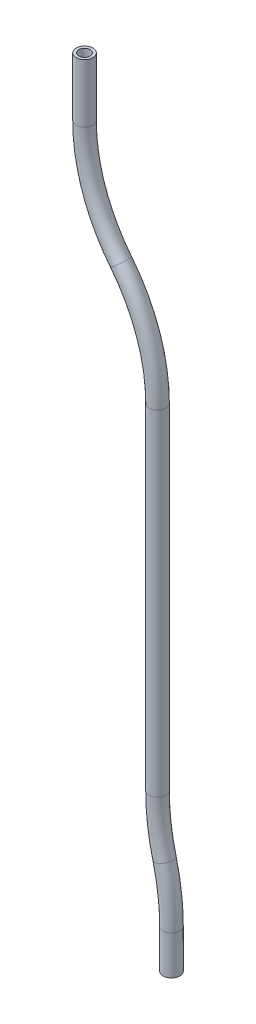
ISO-10303-21;
HEADER;
FILE_DESCRIPTION(('STEP AP214'),'2;1');
FILE_NAME('part.step','',(''),(''),'','','');
FILE_SCHEMA(('AUTOMOTIVE_DESIGN { 1 0 10303 214 1 1 1 1 }'));
ENDSEC;
DATA;
#1=APPLICATION_CONTEXT('core data for automotive mechanical design processes');
#2=APPLICATION_PROTOCOL_DEFINITION('international standard','automotive_design',2000,#1);
#3=PRODUCT_CONTEXT('',#1,'mechanical');
#4=PRODUCT('Part','Part','',(#3));
#5=PRODUCT_RELATED_PRODUCT_CATEGORY('part','',(#4));
#6=PRODUCT_DEFINITION_FORMATION('','',#4);
#7=PRODUCT_DEFINITION_CONTEXT('part definition',#1,'design');
#8=PRODUCT_DEFINITION('design','',#6,#7);
#9=PRODUCT_DEFINITION_SHAPE('','',#8);
#10=(LENGTH_UNIT() NAMED_UNIT(*) SI_UNIT(.MILLI.,.METRE.));
#11=(NAMED_UNIT(*) PLANE_ANGLE_UNIT() SI_UNIT($,.RADIAN.));
#12=(NAMED_UNIT(*) SI_UNIT($,.STERADIAN.) SOLID_ANGLE_UNIT());
#13=UNCERTAINTY_MEASURE_WITH_UNIT(LENGTH_MEASURE(1.E-05),#10,'distance_accuracy_value','');
#14=(GEOMETRIC_REPRESENTATION_CONTEXT(3) GLOBAL_UNCERTAINTY_ASSIGNED_CONTEXT((#13)) GLOBAL_UNIT_ASSIGNED_CONTEXT((#10,
#11,#12)) REPRESENTATION_CONTEXT('',''));
#15=CARTESIAN_POINT('',(0.,0.,0.));
#16=DIRECTION('',(0.,0.,1.));
#17=DIRECTION('',(1.,0.,0.));
#18=AXIS2_PLACEMENT_3D('',#15,#16,#17);
#19=CARTESIAN_POINT('',(0.,15.,0.));
#20=DIRECTION('',(0.,1.,0.));
#21=DIRECTION('',(0.,0.,1.));
#22=AXIS2_PLACEMENT_3D('',#19,#20,#21);
#23=PLANE('',#22);
#24=CARTESIAN_POINT('',(0.,15.,0.));
#25=DIRECTION('',(0.,1.,0.));
#26=DIRECTION('',(0.,0.,1.));
#27=AXIS2_PLACEMENT_3D('',#24,#25,#26);
#28=CIRCLE('',#27,3.);
#29=CARTESIAN_POINT('',(0.,15.,3.));
#30=VERTEX_POINT('',#29);
#31=EDGE_CURVE('E11',#30,#30,#28,.T.);
#32=ORIENTED_EDGE('',*,*,#31,.T.);
#33=EDGE_LOOP('',(#32));
#34=FACE_BOUND('',#33,.T.);
#35=CARTESIAN_POINT('',(0.,15.,0.));
#36=DIRECTION('',(0.,1.,0.));
#37=DIRECTION('',(0.,0.,1.));
#38=AXIS2_PLACEMENT_3D('',#35,#36,#37);
#39=CIRCLE('',#38,2.);
#40=CARTESIAN_POINT('',(0.,15.,2.));
#41=VERTEX_POINT('',#40);
#42=EDGE_CURVE('E42',#41,#41,#39,.T.);
#43=ORIENTED_EDGE('',*,*,#42,.F.);
#44=EDGE_LOOP('',(#43));
#45=FACE_BOUND('',#44,.T.);
#46=ADVANCED_FACE('F34',(#34,#45),#23,.T.);
#47=CARTESIAN_POINT('',(0.,15.,0.));
#48=DIRECTION('',(0.,-1.,0.));
#49=DIRECTION('',(0.,0.,-1.));
#50=AXIS2_PLACEMENT_3D('',#47,#48,#49);
#51=CYLINDRICAL_SURFACE('',#50,3.);
#52=ORIENTED_EDGE('',*,*,#31,.F.);
#53=EDGE_LOOP('',(#52));
#54=FACE_BOUND('',#53,.T.);
#55=CARTESIAN_POINT('',(0.,-6.,0.));
#56=DIRECTION('',(0.,1.,0.));
#57=DIRECTION('',(0.,0.,1.));
#58=AXIS2_PLACEMENT_3D('',#55,#56,#57);
#59=CIRCLE('',#58,3.);
#60=CARTESIAN_POINT('',(-3.,-6.,0.));
#61=VERTEX_POINT('',#60);
#62=EDGE_CURVE('E66',#61,#61,#59,.T.);
#63=ORIENTED_EDGE('',*,*,#62,.T.);
#64=EDGE_LOOP('',(#63));
#65=FACE_BOUND('',#64,.T.);
#66=ADVANCED_FACE('F36',(#54,#65),#51,.T.);
#67=CARTESIAN_POINT('',(0.,15.,0.));
#68=DIRECTION('',(0.,-1.,0.));
#69=DIRECTION('',(0.,0.,-1.));
#70=AXIS2_PLACEMENT_3D('',#67,#68,#69);
#71=CYLINDRICAL_SURFACE('',#70,2.);
#72=ORIENTED_EDGE('',*,*,#42,.T.);
#73=EDGE_LOOP('',(#72));
#74=FACE_BOUND('',#73,.T.);
#75=CARTESIAN_POINT('',(0.,-6.,0.));
#76=DIRECTION('',(0.,1.,0.));
#77=DIRECTION('',(0.,0.,1.));
#78=AXIS2_PLACEMENT_3D('',#75,#76,#77);
#79=CIRCLE('',#78,2.);
#80=CARTESIAN_POINT('',(-2.,-6.,0.));
#81=VERTEX_POINT('',#80);
#82=EDGE_CURVE('E64',#81,#81,#79,.F.);
#83=ORIENTED_EDGE('',*,*,#82,.T.);
#84=EDGE_LOOP('',(#83));
#85=FACE_BOUND('',#84,.T.);
#86=ADVANCED_FACE('F106',(#74,#85),#71,.F.);
#87=CARTESIAN_POINT('',(60.,-5.99999999999999,0.));
#88=DIRECTION('',(0.,0.,1.));
#89=DIRECTION('',(1.,0.,0.));
#90=AXIS2_PLACEMENT_3D('',#87,#88,#89);
#91=TOROIDAL_SURFACE('',#90,60.,3.);
#92=CARTESIAN_POINT('',(13.1,-43.4217850990569,0.));
#93=DIRECTION('',(-0.623696418317615,0.781666666666667,0.));
#94=DIRECTION('',(0.,0.,1.));
#95=AXIS2_PLACEMENT_3D('',#92,#93,#94);
#96=CIRCLE('',#95,3.);
#97=CARTESIAN_POINT('',(10.755,-45.2928743540098,0.));
#98=VERTEX_POINT('',#97);
#99=EDGE_CURVE('E69',#98,#98,#96,.T.);
#100=CARTESIAN_POINT('',(60.,-5.99999999999999,0.));
#101=DIRECTION('',(0.,0.,1.));
#102=DIRECTION('',(1.,0.,0.));
#103=AXIS2_PLACEMENT_3D('',#100,#101,#102);
#104=CIRCLE('',#103,63.);
#105=EDGE_CURVE('',#61,#98,#104,.T.);
#106=ORIENTED_EDGE('',*,*,#62,.F.);
#107=ORIENTED_EDGE('',*,*,#99,.T.);
#108=ORIENTED_EDGE('',*,*,#105,.T.);
#109=ORIENTED_EDGE('',*,*,#105,.F.);
#110=EDGE_LOOP('',(#106,#108,#107,#109));
#111=FACE_BOUND('',#110,.T.);
#112=ADVANCED_FACE('F110',(#111),#91,.T.);
#113=CARTESIAN_POINT('',(-33.8,-80.8435701981139,0.));
#114=DIRECTION('',(0.,0.,-1.));
#115=DIRECTION('',(-1.,0.,0.));
#116=AXIS2_PLACEMENT_3D('',#113,#114,#115);
#117=TOROIDAL_SURFACE('',#116,60.,3.);
#118=CARTESIAN_POINT('',(26.2,-80.8435701981139,0.));
#119=DIRECTION('',(0.,1.,0.));
#120=DIRECTION('',(0.,0.,1.));
#121=AXIS2_PLACEMENT_3D('',#118,#119,#120);
#122=CIRCLE('',#121,3.);
#123=CARTESIAN_POINT('',(26.2,-80.8435701981139,3.));
#124=VERTEX_POINT('',#123);
#125=EDGE_CURVE('E72',#124,#124,#122,.T.);
#126=ORIENTED_EDGE('',*,*,#125,.T.);
#127=EDGE_LOOP('',(#126));
#128=FACE_BOUND('',#127,.T.);
#129=ORIENTED_EDGE('',*,*,#99,.F.);
#130=EDGE_LOOP('',(#129));
#131=FACE_BOUND('',#130,.T.);
#132=ADVANCED_FACE('F115',(#128,#131),#117,.T.);
#133=CARTESIAN_POINT('',(26.2,-80.8435701981139,0.));
#134=DIRECTION('',(0.,-1.,0.));
#135=DIRECTION('',(1.,0.,0.));
#136=AXIS2_PLACEMENT_3D('',#133,#134,#135);
#137=CYLINDRICAL_SURFACE('',#136,3.);
#138=CARTESIAN_POINT('',(26.2,-201.157300532145,0.));
#139=DIRECTION('',(0.,1.,0.));
#140=DIRECTION('',(0.,0.,1.));
#141=AXIS2_PLACEMENT_3D('',#138,#139,#140);
#142=CIRCLE('',#141,3.);
#143=CARTESIAN_POINT('',(23.2,-201.157300532145,0.));
#144=VERTEX_POINT('',#143);
#145=EDGE_CURVE('E75',#144,#144,#142,.T.);
#146=ORIENTED_EDGE('',*,*,#145,.T.);
#147=EDGE_LOOP('',(#146));
#148=FACE_BOUND('',#147,.T.);
#149=ORIENTED_EDGE('',*,*,#125,.F.);
#150=EDGE_LOOP('',(#149));
#151=FACE_BOUND('',#150,.T.);
#152=ADVANCED_FACE('F132',(#148,#151),#137,.T.);
#153=CARTESIAN_POINT('',(106.2,-201.157300532145,0.));
#154=DIRECTION('',(0.,0.,1.));
#155=DIRECTION('',(1.,0.,0.));
#156=AXIS2_PLACEMENT_3D('',#153,#154,#155);
#157=TOROIDAL_SURFACE('',#156,80.,3.);
#158=CARTESIAN_POINT('',(28.7,-221.000435365129,0.));
#159=DIRECTION('',(-0.248039185412306,0.96875,0.));
#160=DIRECTION('',(0.,0.,1.));
#161=AXIS2_PLACEMENT_3D('',#158,#159,#160);
#162=CIRCLE('',#161,3.);
#163=CARTESIAN_POINT('',(25.79375,-221.744552921366,0.));
#164=VERTEX_POINT('',#163);
#165=EDGE_CURVE('E78',#164,#164,#162,.T.);
#166=CARTESIAN_POINT('',(106.2,-201.157300532145,0.));
#167=DIRECTION('',(0.,0.,1.));
#168=DIRECTION('',(1.,0.,0.));
#169=AXIS2_PLACEMENT_3D('',#166,#167,#168);
#170=CIRCLE('',#169,83.);
#171=EDGE_CURVE('',#144,#164,#170,.T.);
#172=ORIENTED_EDGE('',*,*,#145,.F.);
#173=ORIENTED_EDGE('',*,*,#165,.T.);
#174=ORIENTED_EDGE('',*,*,#171,.T.);
#175=ORIENTED_EDGE('',*,*,#171,.F.);
#176=EDGE_LOOP('',(#172,#174,#173,#175));
#177=FACE_BOUND('',#176,.T.);
#178=ADVANCED_FACE('F98',(#177),#157,.T.);
#179=CARTESIAN_POINT('',(-48.8,-240.843570198114,0.));
#180=DIRECTION('',(0.,0.,-1.));
#181=DIRECTION('',(-1.,0.,0.));
#182=AXIS2_PLACEMENT_3D('',#179,#180,#181);
#183=TOROIDAL_SURFACE('',#182,80.,3.);
#184=CARTESIAN_POINT('',(31.2,-240.843570198114,0.));
#185=DIRECTION('',(0.,1.,0.));
#186=DIRECTION('',(0.,0.,1.));
#187=AXIS2_PLACEMENT_3D('',#184,#185,#186);
#188=CIRCLE('',#187,3.);
#189=CARTESIAN_POINT('',(31.2,-240.843570198114,3.));
#190=VERTEX_POINT('',#189);
#191=EDGE_CURVE('E65',#190,#190,#188,.T.);
#192=ORIENTED_EDGE('',*,*,#191,.T.);
#193=EDGE_LOOP('',(#192));
#194=FACE_BOUND('',#193,.T.);
#195=ORIENTED_EDGE('',*,*,#165,.F.);
#196=EDGE_LOOP('',(#195));
#197=FACE_BOUND('',#196,.T.);
#198=ADVANCED_FACE('F84',(#194,#197),#183,.T.);
#199=CARTESIAN_POINT('',(31.2,-240.843570198114,0.));
#200=DIRECTION('',(0.,-1.,0.));
#201=DIRECTION('',(0.,0.,-1.));
#202=AXIS2_PLACEMENT_3D('',#199,#200,#201);
#203=CYLINDRICAL_SURFACE('',#202,3.);
#204=CARTESIAN_POINT('',(31.2,-254.843570198114,0.));
#205=DIRECTION('',(0.,1.,0.));
#206=DIRECTION('',(0.,0.,1.));
#207=AXIS2_PLACEMENT_3D('',#204,#205,#206);
#208=CIRCLE('',#207,3.);
#209=CARTESIAN_POINT('',(31.2,-254.843570198114,3.));
#210=VERTEX_POINT('',#209);
#211=EDGE_CURVE('E47',#210,#210,#208,.T.);
#212=ORIENTED_EDGE('',*,*,#211,.T.);
#213=EDGE_LOOP('',(#212));
#214=FACE_BOUND('',#213,.T.);
#215=ORIENTED_EDGE('',*,*,#191,.F.);
#216=EDGE_LOOP('',(#215));
#217=FACE_BOUND('',#216,.T.);
#218=ADVANCED_FACE('F87',(#214,#217),#203,.T.);
#219=CARTESIAN_POINT('',(31.2,-254.843570198114,0.));
#220=DIRECTION('',(0.,1.,0.));
#221=DIRECTION('',(0.,0.,1.));
#222=AXIS2_PLACEMENT_3D('',#219,#220,#221);
#223=PLANE('',#222);
#224=CARTESIAN_POINT('',(31.2,-254.843570198114,0.));
#225=DIRECTION('',(0.,1.,0.));
#226=DIRECTION('',(0.,0.,1.));
#227=AXIS2_PLACEMENT_3D('',#224,#225,#226);
#228=CIRCLE('',#227,2.);
#229=CARTESIAN_POINT('',(31.2,-254.843570198114,2.));
#230=VERTEX_POINT('',#229);
#231=EDGE_CURVE('E51',#230,#230,#228,.F.);
#232=ORIENTED_EDGE('',*,*,#231,.F.);
#233=EDGE_LOOP('',(#232));
#234=FACE_BOUND('',#233,.T.);
#235=ORIENTED_EDGE('',*,*,#211,.F.);
#236=EDGE_LOOP('',(#235));
#237=FACE_BOUND('',#236,.T.);
#238=ADVANCED_FACE('F89',(#234,#237),#223,.F.);
#239=CARTESIAN_POINT('',(60.,-5.99999999999999,0.));
#240=DIRECTION('',(0.,0.,1.));
#241=DIRECTION('',(1.,0.,0.));
#242=AXIS2_PLACEMENT_3D('',#239,#240,#241);
#243=TOROIDAL_SURFACE('',#242,60.,2.);
#244=CARTESIAN_POINT('',(13.1,-43.4217850990569,0.));
#245=DIRECTION('',(-0.623696418317615,0.781666666666667,0.));
#246=DIRECTION('',(0.,0.,1.));
#247=AXIS2_PLACEMENT_3D('',#244,#245,#246);
#248=CIRCLE('',#247,2.);
#249=CARTESIAN_POINT('',(11.5366666666667,-44.6691779356921,0.));
#250=VERTEX_POINT('',#249);
#251=EDGE_CURVE('E227',#250,#250,#248,.F.);
#252=CARTESIAN_POINT('',(60.,-5.99999999999999,0.));
#253=DIRECTION('',(0.,0.,1.));
#254=DIRECTION('',(1.,0.,0.));
#255=AXIS2_PLACEMENT_3D('',#252,#253,#254);
#256=CIRCLE('',#255,62.);
#257=EDGE_CURVE('',#81,#250,#256,.T.);
#258=ORIENTED_EDGE('',*,*,#82,.F.);
#259=ORIENTED_EDGE('',*,*,#251,.T.);
#260=ORIENTED_EDGE('',*,*,#257,.T.);
#261=ORIENTED_EDGE('',*,*,#257,.F.);
#262=EDGE_LOOP('',(#258,#260,#259,#261));
#263=FACE_BOUND('',#262,.T.);
#264=ADVANCED_FACE('F96',(#263),#243,.F.);
#265=CARTESIAN_POINT('',(-33.8,-80.8435701981139,0.));
#266=DIRECTION('',(0.,0.,-1.));
#267=DIRECTION('',(-1.,0.,0.));
#268=AXIS2_PLACEMENT_3D('',#265,#266,#267);
#269=TOROIDAL_SURFACE('',#268,60.,2.);
#270=CARTESIAN_POINT('',(26.2,-80.8435701981139,0.));
#271=DIRECTION('',(0.,1.,0.));
#272=DIRECTION('',(0.,0.,1.));
#273=AXIS2_PLACEMENT_3D('',#270,#271,#272);
#274=CIRCLE('',#273,2.);
#275=CARTESIAN_POINT('',(26.2,-80.8435701981139,2.));
#276=VERTEX_POINT('',#275);
#277=EDGE_CURVE('E224',#276,#276,#274,.F.);
#278=ORIENTED_EDGE('',*,*,#277,.T.);
#279=EDGE_LOOP('',(#278));
#280=FACE_BOUND('',#279,.T.);
#281=ORIENTED_EDGE('',*,*,#251,.F.);
#282=EDGE_LOOP('',(#281));
#283=FACE_BOUND('',#282,.T.);
#284=ADVANCED_FACE('F176',(#280,#283),#269,.F.);
#285=CARTESIAN_POINT('',(26.2,-80.8435701981139,0.));
#286=DIRECTION('',(0.,-1.,0.));
#287=DIRECTION('',(1.,0.,0.));
#288=AXIS2_PLACEMENT_3D('',#285,#286,#287);
#289=CYLINDRICAL_SURFACE('',#288,2.);
#290=CARTESIAN_POINT('',(26.2,-201.157300532145,0.));
#291=DIRECTION('',(0.,1.,0.));
#292=DIRECTION('',(0.,0.,1.));
#293=AXIS2_PLACEMENT_3D('',#290,#291,#292);
#294=CIRCLE('',#293,2.);
#295=CARTESIAN_POINT('',(24.2,-201.157300532145,0.));
#296=VERTEX_POINT('',#295);
#297=EDGE_CURVE('E223',#296,#296,#294,.F.);
#298=ORIENTED_EDGE('',*,*,#297,.T.);
#299=EDGE_LOOP('',(#298));
#300=FACE_BOUND('',#299,.T.);
#301=ORIENTED_EDGE('',*,*,#277,.F.);
#302=EDGE_LOOP('',(#301));
#303=FACE_BOUND('',#302,.T.);
#304=ADVANCED_FACE('F186',(#300,#303),#289,.F.);
#305=CARTESIAN_POINT('',(106.2,-201.157300532145,0.));
#306=DIRECTION('',(0.,0.,1.));
#307=DIRECTION('',(1.,0.,0.));
#308=AXIS2_PLACEMENT_3D('',#305,#306,#307);
#309=TOROIDAL_SURFACE('',#308,80.,2.);
#310=CARTESIAN_POINT('',(28.7,-221.000435365129,0.));
#311=DIRECTION('',(-0.248039185412306,0.96875,0.));
#312=DIRECTION('',(0.,0.,1.));
#313=AXIS2_PLACEMENT_3D('',#310,#311,#312);
#314=CIRCLE('',#313,2.);
#315=CARTESIAN_POINT('',(26.7625,-221.496513735954,0.));
#316=VERTEX_POINT('',#315);
#317=EDGE_CURVE('E59',#316,#316,#314,.F.);
#318=CARTESIAN_POINT('',(106.2,-201.157300532145,0.));
#319=DIRECTION('',(0.,0.,1.));
#320=DIRECTION('',(1.,0.,0.));
#321=AXIS2_PLACEMENT_3D('',#318,#319,#320);
#322=CIRCLE('',#321,82.);
#323=EDGE_CURVE('',#296,#316,#322,.T.);
#324=ORIENTED_EDGE('',*,*,#297,.F.);
#325=ORIENTED_EDGE('',*,*,#317,.T.);
#326=ORIENTED_EDGE('',*,*,#323,.T.);
#327=ORIENTED_EDGE('',*,*,#323,.F.);
#328=EDGE_LOOP('',(#324,#326,#325,#327));
#329=FACE_BOUND('',#328,.T.);
#330=ADVANCED_FACE('F125',(#329),#309,.F.);
#331=CARTESIAN_POINT('',(-48.8,-240.843570198114,0.));
#332=DIRECTION('',(0.,0.,-1.));
#333=DIRECTION('',(-1.,0.,0.));
#334=AXIS2_PLACEMENT_3D('',#331,#332,#333);
#335=TOROIDAL_SURFACE('',#334,80.,2.);
#336=CARTESIAN_POINT('',(31.2,-240.843570198114,0.));
#337=DIRECTION('',(0.,1.,0.));
#338=DIRECTION('',(0.,0.,1.));
#339=AXIS2_PLACEMENT_3D('',#336,#337,#338);
#340=CIRCLE('',#339,2.);
#341=CARTESIAN_POINT('',(31.2,-240.843570198114,2.));
#342=VERTEX_POINT('',#341);
#343=EDGE_CURVE('E55',#342,#342,#340,.F.);
#344=ORIENTED_EDGE('',*,*,#343,.T.);
#345=EDGE_LOOP('',(#344));
#346=FACE_BOUND('',#345,.T.);
#347=ORIENTED_EDGE('',*,*,#317,.F.);
#348=EDGE_LOOP('',(#347));
#349=FACE_BOUND('',#348,.T.);
#350=ADVANCED_FACE('F120',(#346,#349),#335,.F.);
#351=CARTESIAN_POINT('',(31.2,-240.843570198114,0.));
#352=DIRECTION('',(0.,-1.,0.));
#353=DIRECTION('',(0.,0.,-1.));
#354=AXIS2_PLACEMENT_3D('',#351,#352,#353);
#355=CYLINDRICAL_SURFACE('',#354,2.);
#356=ORIENTED_EDGE('',*,*,#231,.T.);
#357=EDGE_LOOP('',(#356));
#358=FACE_BOUND('',#357,.T.);
#359=ORIENTED_EDGE('',*,*,#343,.F.);
#360=EDGE_LOOP('',(#359));
#361=FACE_BOUND('',#360,.T.);
#362=ADVANCED_FACE('F52',(#358,#361),#355,.F.);
#363=CLOSED_SHELL('',(#46,#66,#86,#112,#132,#152,#178,#198,#218,#238,#264,#284,#304,#330,#350,#362));
#364=MANIFOLD_SOLID_BREP('B2',#363);
#365=ADVANCED_BREP_SHAPE_REPRESENTATION('',(#18,#364),#14);
#366=SHAPE_DEFINITION_REPRESENTATION(#9,#365);
ENDSEC;
END-ISO-10303-21;
